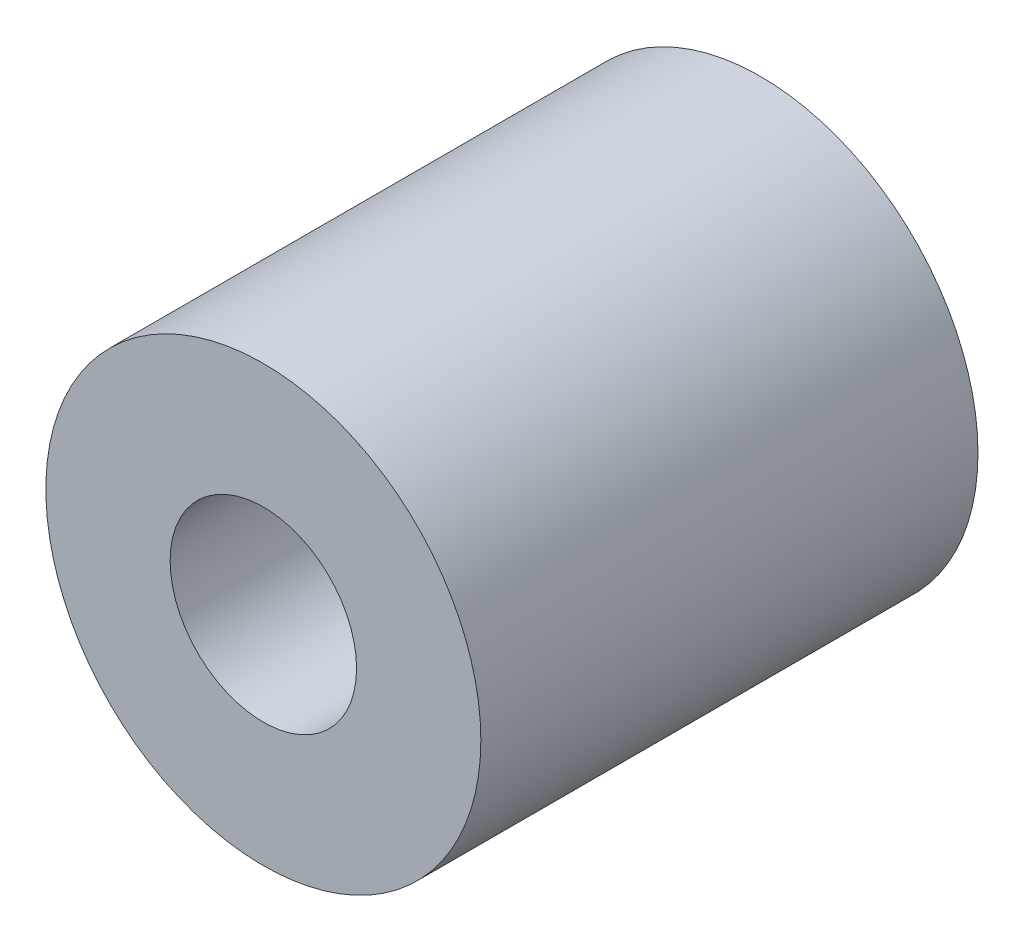
ISO-10303-21;
HEADER;
FILE_DESCRIPTION(('STEP AP214'),'2;1');
FILE_NAME('part.step','',(''),(''),'','','');
FILE_SCHEMA(('AUTOMOTIVE_DESIGN { 1 0 10303 214 1 1 1 1 }'));
ENDSEC;
DATA;
#1=APPLICATION_CONTEXT('core data for automotive mechanical design processes');
#2=APPLICATION_PROTOCOL_DEFINITION('international standard','automotive_design',2000,#1);
#3=PRODUCT_CONTEXT('',#1,'mechanical');
#4=PRODUCT('Part','Part','',(#3));
#5=PRODUCT_RELATED_PRODUCT_CATEGORY('part','',(#4));
#6=PRODUCT_DEFINITION_FORMATION('','',#4);
#7=PRODUCT_DEFINITION_CONTEXT('part definition',#1,'design');
#8=PRODUCT_DEFINITION('design','',#6,#7);
#9=PRODUCT_DEFINITION_SHAPE('','',#8);
#10=(LENGTH_UNIT() NAMED_UNIT(*) SI_UNIT(.MILLI.,.METRE.));
#11=(NAMED_UNIT(*) PLANE_ANGLE_UNIT() SI_UNIT($,.RADIAN.));
#12=(NAMED_UNIT(*) SI_UNIT($,.STERADIAN.) SOLID_ANGLE_UNIT());
#13=UNCERTAINTY_MEASURE_WITH_UNIT(LENGTH_MEASURE(1.E-05),#10,'distance_accuracy_value','');
#14=(GEOMETRIC_REPRESENTATION_CONTEXT(3) GLOBAL_UNCERTAINTY_ASSIGNED_CONTEXT((#13)) GLOBAL_UNIT_ASSIGNED_CONTEXT((#10,
#11,#12)) REPRESENTATION_CONTEXT('',''));
#15=CARTESIAN_POINT('',(0.,0.,0.));
#16=DIRECTION('',(0.,0.,1.));
#17=DIRECTION('',(1.,0.,0.));
#18=AXIS2_PLACEMENT_3D('',#15,#16,#17);
#19=CARTESIAN_POINT('',(0.,0.,12.7));
#20=DIRECTION('',(0.,0.,1.));
#21=DIRECTION('',(1.,0.,0.));
#22=AXIS2_PLACEMENT_3D('',#19,#20,#21);
#23=PLANE('',#22);
#24=CARTESIAN_POINT('',(0.,0.,12.7));
#25=DIRECTION('',(0.,0.,1.));
#26=DIRECTION('',(1.,0.,0.));
#27=AXIS2_PLACEMENT_3D('',#24,#25,#26);
#28=CIRCLE('',#27,11.1125);
#29=CARTESIAN_POINT('',(11.1125,0.,12.7));
#30=VERTEX_POINT('',#29);
#31=EDGE_CURVE('E10',#30,#30,#28,.T.);
#32=ORIENTED_EDGE('',*,*,#31,.T.);
#33=EDGE_LOOP('',(#32));
#34=FACE_BOUND('',#33,.T.);
#35=CARTESIAN_POINT('',(0.,0.,12.7));
#36=DIRECTION('',(0.,0.,1.));
#37=DIRECTION('',(1.,0.,0.));
#38=AXIS2_PLACEMENT_3D('',#35,#36,#37);
#39=CIRCLE('',#38,4.7625);
#40=CARTESIAN_POINT('',(4.7625,0.,12.7));
#41=VERTEX_POINT('',#40);
#42=EDGE_CURVE('E42',#41,#41,#39,.T.);
#43=ORIENTED_EDGE('',*,*,#42,.F.);
#44=EDGE_LOOP('',(#43));
#45=FACE_BOUND('',#44,.T.);
#46=ADVANCED_FACE('F31',(#34,#45),#23,.T.);
#47=CARTESIAN_POINT('',(0.,0.,-12.7));
#48=DIRECTION('',(0.,0.,1.));
#49=DIRECTION('',(1.,0.,0.));
#50=AXIS2_PLACEMENT_3D('',#47,#48,#49);
#51=PLANE('',#50);
#52=CARTESIAN_POINT('',(0.,0.,-12.7));
#53=DIRECTION('',(0.,0.,1.));
#54=DIRECTION('',(1.,0.,0.));
#55=AXIS2_PLACEMENT_3D('',#52,#53,#54);
#56=CIRCLE('',#55,11.1125);
#57=CARTESIAN_POINT('',(11.1125,0.,-12.7));
#58=VERTEX_POINT('',#57);
#59=EDGE_CURVE('E35',#58,#58,#56,.T.);
#60=ORIENTED_EDGE('',*,*,#59,.F.);
#61=EDGE_LOOP('',(#60));
#62=FACE_BOUND('',#61,.T.);
#63=CARTESIAN_POINT('',(0.,0.,-12.7));
#64=DIRECTION('',(0.,0.,1.));
#65=DIRECTION('',(1.,0.,0.));
#66=AXIS2_PLACEMENT_3D('',#63,#64,#65);
#67=CIRCLE('',#66,4.7625);
#68=CARTESIAN_POINT('',(4.7625,0.,-12.7));
#69=VERTEX_POINT('',#68);
#70=EDGE_CURVE('E44',#69,#69,#67,.T.);
#71=ORIENTED_EDGE('',*,*,#70,.T.);
#72=EDGE_LOOP('',(#71));
#73=FACE_BOUND('',#72,.T.);
#74=ADVANCED_FACE('F54',(#62,#73),#51,.F.);
#75=CARTESIAN_POINT('',(0.,0.,12.7));
#76=DIRECTION('',(0.,0.,-1.));
#77=DIRECTION('',(-1.,0.,0.));
#78=AXIS2_PLACEMENT_3D('',#75,#76,#77);
#79=CYLINDRICAL_SURFACE('',#78,11.1125);
#80=ORIENTED_EDGE('',*,*,#31,.F.);
#81=EDGE_LOOP('',(#80));
#82=FACE_BOUND('',#81,.T.);
#83=ORIENTED_EDGE('',*,*,#59,.T.);
#84=EDGE_LOOP('',(#83));
#85=FACE_BOUND('',#84,.T.);
#86=ADVANCED_FACE('F33',(#82,#85),#79,.T.);
#87=CARTESIAN_POINT('',(0.,0.,12.7));
#88=DIRECTION('',(0.,0.,-1.));
#89=DIRECTION('',(-1.,0.,0.));
#90=AXIS2_PLACEMENT_3D('',#87,#88,#89);
#91=CYLINDRICAL_SURFACE('',#90,4.7625);
#92=ORIENTED_EDGE('',*,*,#42,.T.);
#93=EDGE_LOOP('',(#92));
#94=FACE_BOUND('',#93,.T.);
#95=ORIENTED_EDGE('',*,*,#70,.F.);
#96=EDGE_LOOP('',(#95));
#97=FACE_BOUND('',#96,.T.);
#98=ADVANCED_FACE('F50',(#94,#97),#91,.F.);
#99=CLOSED_SHELL('',(#46,#74,#86,#98));
#100=MANIFOLD_SOLID_BREP('B2',#99);
#101=ADVANCED_BREP_SHAPE_REPRESENTATION('',(#18,#100),#14);
#102=SHAPE_DEFINITION_REPRESENTATION(#9,#101);
ENDSEC;
END-ISO-10303-21;
